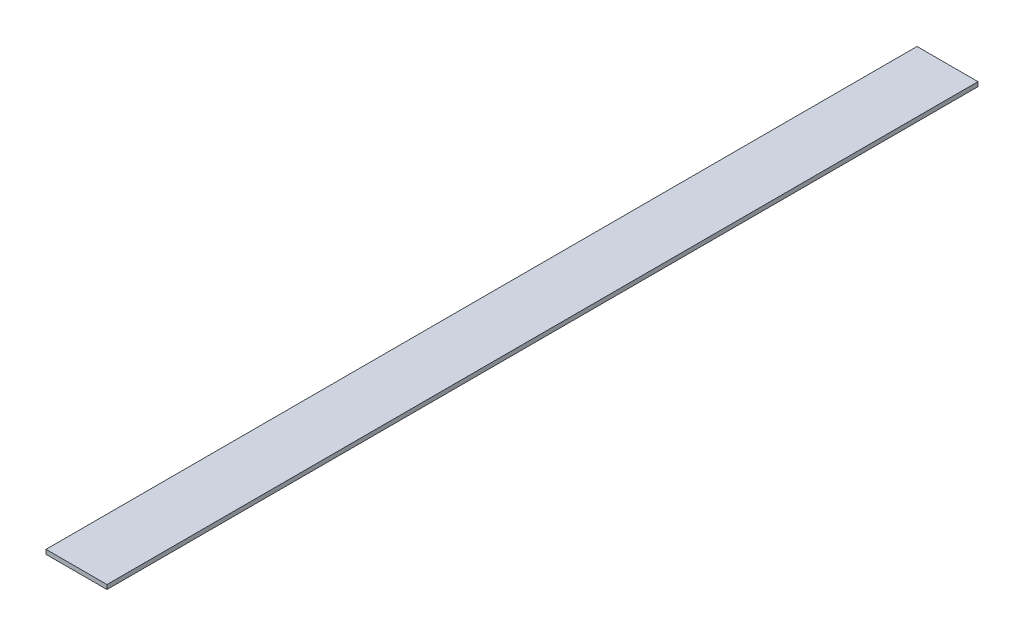
ISO-10303-21;
HEADER;
FILE_DESCRIPTION(('STEP AP214'),'2;1');
FILE_NAME('part.step','',(''),(''),'','','');
FILE_SCHEMA(('AUTOMOTIVE_DESIGN { 1 0 10303 214 1 1 1 1 }'));
ENDSEC;
DATA;
#1=APPLICATION_CONTEXT('core data for automotive mechanical design processes');
#2=APPLICATION_PROTOCOL_DEFINITION('international standard','automotive_design',2000,#1);
#3=PRODUCT_CONTEXT('',#1,'mechanical');
#4=PRODUCT('Part','Part','',(#3));
#5=PRODUCT_RELATED_PRODUCT_CATEGORY('part','',(#4));
#6=PRODUCT_DEFINITION_FORMATION('','',#4);
#7=PRODUCT_DEFINITION_CONTEXT('part definition',#1,'design');
#8=PRODUCT_DEFINITION('design','',#6,#7);
#9=PRODUCT_DEFINITION_SHAPE('','',#8);
#10=(LENGTH_UNIT() NAMED_UNIT(*) SI_UNIT(.MILLI.,.METRE.));
#11=(NAMED_UNIT(*) PLANE_ANGLE_UNIT() SI_UNIT($,.RADIAN.));
#12=(NAMED_UNIT(*) SI_UNIT($,.STERADIAN.) SOLID_ANGLE_UNIT());
#13=UNCERTAINTY_MEASURE_WITH_UNIT(LENGTH_MEASURE(1.E-05),#10,'distance_accuracy_value','');
#14=(GEOMETRIC_REPRESENTATION_CONTEXT(3) GLOBAL_UNCERTAINTY_ASSIGNED_CONTEXT((#13)) GLOBAL_UNIT_ASSIGNED_CONTEXT((#10,
#11,#12)) REPRESENTATION_CONTEXT('',''));
#15=CARTESIAN_POINT('',(0.,0.,0.));
#16=DIRECTION('',(0.,0.,1.));
#17=DIRECTION('',(1.,0.,0.));
#18=AXIS2_PLACEMENT_3D('',#15,#16,#17);
#19=CARTESIAN_POINT('',(0.,1.,0.));
#20=DIRECTION('',(1.,0.,0.));
#21=DIRECTION('',(0.,0.,-1.));
#22=AXIS2_PLACEMENT_3D('',#19,#20,#21);
#23=PLANE('',#22);
#24=DIRECTION('',(0.,0.,1.));
#25=VECTOR('',#24,1.);
#26=CARTESIAN_POINT('',(0.,0.,0.));
#27=LINE('',#26,#25);
#28=CARTESIAN_POINT('',(0.,0.,-200.));
#29=VERTEX_POINT('',#28);
#30=CARTESIAN_POINT('',(0.,0.,0.));
#31=VERTEX_POINT('',#30);
#32=EDGE_CURVE('E113',#29,#31,#27,.T.);
#33=ORIENTED_EDGE('',*,*,#32,.T.);
#34=DIRECTION('',(0.,-1.,0.));
#35=VECTOR('',#34,1.);
#36=CARTESIAN_POINT('',(0.,1.,0.));
#37=LINE('',#36,#35);
#38=CARTESIAN_POINT('',(0.,1.,0.));
#39=VERTEX_POINT('',#38);
#40=EDGE_CURVE('E11',#39,#31,#37,.T.);
#41=ORIENTED_EDGE('',*,*,#40,.F.);
#42=DIRECTION('',(0.,0.,1.));
#43=VECTOR('',#42,1.);
#44=CARTESIAN_POINT('',(0.,1.,0.));
#45=LINE('',#44,#43);
#46=CARTESIAN_POINT('',(0.,1.,-200.));
#47=VERTEX_POINT('',#46);
#48=EDGE_CURVE('E97',#47,#39,#45,.T.);
#49=ORIENTED_EDGE('',*,*,#48,.F.);
#50=DIRECTION('',(0.,-1.,0.));
#51=VECTOR('',#50,1.);
#52=CARTESIAN_POINT('',(0.,1.,-200.));
#53=LINE('',#52,#51);
#54=EDGE_CURVE('E109',#47,#29,#53,.T.);
#55=ORIENTED_EDGE('',*,*,#54,.T.);
#56=EDGE_LOOP('',(#33,#41,#49,#55));
#57=FACE_BOUND('',#56,.T.);
#58=ADVANCED_FACE('F45',(#57),#23,.F.);
#59=CARTESIAN_POINT('',(0.,1.,0.));
#60=DIRECTION('',(0.,0.,-1.));
#61=DIRECTION('',(-1.,0.,0.));
#62=AXIS2_PLACEMENT_3D('',#59,#60,#61);
#63=PLANE('',#62);
#64=DIRECTION('',(1.,0.,0.));
#65=VECTOR('',#64,1.);
#66=CARTESIAN_POINT('',(0.,0.,0.));
#67=LINE('',#66,#65);
#68=CARTESIAN_POINT('',(14.,0.,0.));
#69=VERTEX_POINT('',#68);
#70=EDGE_CURVE('E102',#31,#69,#67,.T.);
#71=ORIENTED_EDGE('',*,*,#70,.T.);
#72=DIRECTION('',(0.,-1.,0.));
#73=VECTOR('',#72,1.);
#74=CARTESIAN_POINT('',(14.,1.,0.));
#75=LINE('',#74,#73);
#76=CARTESIAN_POINT('',(14.,1.,0.));
#77=VERTEX_POINT('',#76);
#78=EDGE_CURVE('E54',#77,#69,#75,.T.);
#79=ORIENTED_EDGE('',*,*,#78,.F.);
#80=DIRECTION('',(1.,0.,0.));
#81=VECTOR('',#80,1.);
#82=CARTESIAN_POINT('',(0.,1.,0.));
#83=LINE('',#82,#81);
#84=EDGE_CURVE('E92',#39,#77,#83,.T.);
#85=ORIENTED_EDGE('',*,*,#84,.F.);
#86=ORIENTED_EDGE('',*,*,#40,.T.);
#87=EDGE_LOOP('',(#71,#79,#85,#86));
#88=FACE_BOUND('',#87,.T.);
#89=ADVANCED_FACE('F101',(#88),#63,.F.);
#90=CARTESIAN_POINT('',(14.,1.,0.));
#91=DIRECTION('',(-1.,0.,0.));
#92=DIRECTION('',(0.,0.,1.));
#93=AXIS2_PLACEMENT_3D('',#90,#91,#92);
#94=PLANE('',#93);
#95=DIRECTION('',(0.,0.,-1.));
#96=VECTOR('',#95,1.);
#97=CARTESIAN_POINT('',(14.,0.,0.));
#98=LINE('',#97,#96);
#99=CARTESIAN_POINT('',(14.,0.,-200.));
#100=VERTEX_POINT('',#99);
#101=EDGE_CURVE('E79',#69,#100,#98,.T.);
#102=ORIENTED_EDGE('',*,*,#101,.T.);
#103=DIRECTION('',(0.,-1.,0.));
#104=VECTOR('',#103,1.);
#105=CARTESIAN_POINT('',(14.,1.,-200.));
#106=LINE('',#105,#104);
#107=CARTESIAN_POINT('',(14.,1.,-200.));
#108=VERTEX_POINT('',#107);
#109=EDGE_CURVE('E104',#108,#100,#106,.T.);
#110=ORIENTED_EDGE('',*,*,#109,.F.);
#111=DIRECTION('',(0.,0.,-1.));
#112=VECTOR('',#111,1.);
#113=CARTESIAN_POINT('',(14.,1.,0.));
#114=LINE('',#113,#112);
#115=EDGE_CURVE('E95',#77,#108,#114,.T.);
#116=ORIENTED_EDGE('',*,*,#115,.F.);
#117=ORIENTED_EDGE('',*,*,#78,.T.);
#118=EDGE_LOOP('',(#102,#110,#116,#117));
#119=FACE_BOUND('',#118,.T.);
#120=ADVANCED_FACE('F105',(#119),#94,.F.);
#121=CARTESIAN_POINT('',(0.,1.,-200.));
#122=DIRECTION('',(0.,0.,1.));
#123=DIRECTION('',(1.,0.,0.));
#124=AXIS2_PLACEMENT_3D('',#121,#122,#123);
#125=PLANE('',#124);
#126=DIRECTION('',(-1.,0.,0.));
#127=VECTOR('',#126,1.);
#128=CARTESIAN_POINT('',(0.,0.,-200.));
#129=LINE('',#128,#127);
#130=EDGE_CURVE('E85',#100,#29,#129,.T.);
#131=ORIENTED_EDGE('',*,*,#130,.T.);
#132=ORIENTED_EDGE('',*,*,#54,.F.);
#133=DIRECTION('',(-1.,0.,0.));
#134=VECTOR('',#133,1.);
#135=CARTESIAN_POINT('',(0.,1.,-200.));
#136=LINE('',#135,#134);
#137=EDGE_CURVE('E62',#108,#47,#136,.T.);
#138=ORIENTED_EDGE('',*,*,#137,.F.);
#139=ORIENTED_EDGE('',*,*,#109,.T.);
#140=EDGE_LOOP('',(#131,#132,#138,#139));
#141=FACE_BOUND('',#140,.T.);
#142=ADVANCED_FACE('F126',(#141),#125,.F.);
#143=CARTESIAN_POINT('',(0.,1.,0.));
#144=DIRECTION('',(0.,-1.,0.));
#145=DIRECTION('',(0.,0.,-1.));
#146=AXIS2_PLACEMENT_3D('',#143,#144,#145);
#147=PLANE('',#146);
#148=ORIENTED_EDGE('',*,*,#48,.T.);
#149=ORIENTED_EDGE('',*,*,#84,.T.);
#150=ORIENTED_EDGE('',*,*,#115,.T.);
#151=ORIENTED_EDGE('',*,*,#137,.T.);
#152=EDGE_LOOP('',(#148,#149,#150,#151));
#153=FACE_BOUND('',#152,.T.);
#154=ADVANCED_FACE('F93',(#153),#147,.F.);
#155=CARTESIAN_POINT('',(0.,0.,0.));
#156=DIRECTION('',(0.,-1.,0.));
#157=DIRECTION('',(0.,0.,-1.));
#158=AXIS2_PLACEMENT_3D('',#155,#156,#157);
#159=PLANE('',#158);
#160=ORIENTED_EDGE('',*,*,#32,.F.);
#161=ORIENTED_EDGE('',*,*,#130,.F.);
#162=ORIENTED_EDGE('',*,*,#101,.F.);
#163=ORIENTED_EDGE('',*,*,#70,.F.);
#164=EDGE_LOOP('',(#160,#161,#162,#163));
#165=FACE_BOUND('',#164,.T.);
#166=ADVANCED_FACE('F129',(#165),#159,.T.);
#167=CLOSED_SHELL('',(#58,#89,#120,#142,#154,#166));
#168=MANIFOLD_SOLID_BREP('B2',#167);
#169=ADVANCED_BREP_SHAPE_REPRESENTATION('',(#18,#168),#14);
#170=SHAPE_DEFINITION_REPRESENTATION(#9,#169);
ENDSEC;
END-ISO-10303-21;
